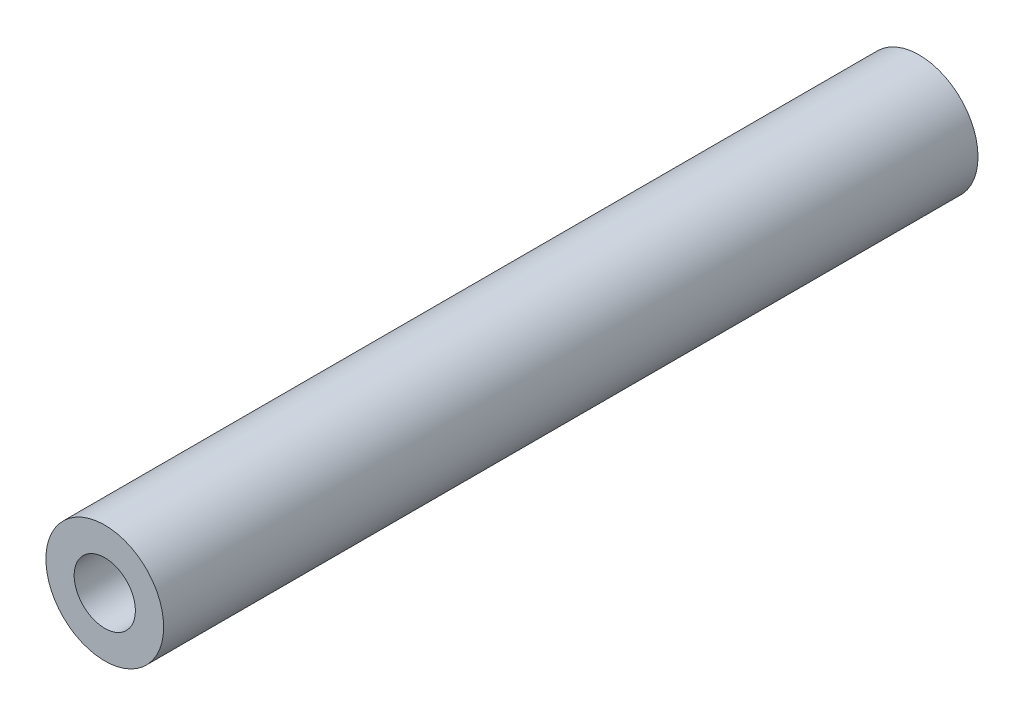
ISO-10303-21;
HEADER;
FILE_DESCRIPTION(('STEP AP214'),'2;1');
FILE_NAME('part.step','',(''),(''),'','','');
FILE_SCHEMA(('AUTOMOTIVE_DESIGN { 1 0 10303 214 1 1 1 1 }'));
ENDSEC;
DATA;
#1=APPLICATION_CONTEXT('core data for automotive mechanical design processes');
#2=APPLICATION_PROTOCOL_DEFINITION('international standard','automotive_design',2000,#1);
#3=PRODUCT_CONTEXT('',#1,'mechanical');
#4=PRODUCT('Part','Part','',(#3));
#5=PRODUCT_RELATED_PRODUCT_CATEGORY('part','',(#4));
#6=PRODUCT_DEFINITION_FORMATION('','',#4);
#7=PRODUCT_DEFINITION_CONTEXT('part definition',#1,'design');
#8=PRODUCT_DEFINITION('design','',#6,#7);
#9=PRODUCT_DEFINITION_SHAPE('','',#8);
#10=(LENGTH_UNIT() NAMED_UNIT(*) SI_UNIT(.MILLI.,.METRE.));
#11=(NAMED_UNIT(*) PLANE_ANGLE_UNIT() SI_UNIT($,.RADIAN.));
#12=(NAMED_UNIT(*) SI_UNIT($,.STERADIAN.) SOLID_ANGLE_UNIT());
#13=UNCERTAINTY_MEASURE_WITH_UNIT(LENGTH_MEASURE(1.E-05),#10,'distance_accuracy_value','');
#14=(GEOMETRIC_REPRESENTATION_CONTEXT(3) GLOBAL_UNCERTAINTY_ASSIGNED_CONTEXT((#13)) GLOBAL_UNIT_ASSIGNED_CONTEXT((#10,
#11,#12)) REPRESENTATION_CONTEXT('',''));
#15=CARTESIAN_POINT('',(0.,0.,0.));
#16=DIRECTION('',(0.,0.,1.));
#17=DIRECTION('',(1.,0.,0.));
#18=AXIS2_PLACEMENT_3D('',#15,#16,#17);
#19=CARTESIAN_POINT('',(0.,0.,21.9577));
#20=DIRECTION('',(0.,0.,1.));
#21=DIRECTION('',(1.,0.,0.));
#22=AXIS2_PLACEMENT_3D('',#19,#20,#21);
#23=PLANE('',#22);
#24=CARTESIAN_POINT('',(0.,0.,21.9577));
#25=DIRECTION('',(0.,0.,1.));
#26=DIRECTION('',(1.,0.,0.));
#27=AXIS2_PLACEMENT_3D('',#24,#25,#26);
#28=CIRCLE('',#27,1.5875);
#29=CARTESIAN_POINT('',(1.5875,0.,21.9577));
#30=VERTEX_POINT('',#29);
#31=EDGE_CURVE('E10',#30,#30,#28,.T.);
#32=ORIENTED_EDGE('',*,*,#31,.T.);
#33=EDGE_LOOP('',(#32));
#34=FACE_BOUND('',#33,.T.);
#35=CARTESIAN_POINT('',(0.,0.,21.9577));
#36=DIRECTION('',(0.,0.,1.));
#37=DIRECTION('',(1.,0.,0.));
#38=AXIS2_PLACEMENT_3D('',#35,#36,#37);
#39=CIRCLE('',#38,0.8255);
#40=CARTESIAN_POINT('',(0.8255,0.,21.9577));
#41=VERTEX_POINT('',#40);
#42=EDGE_CURVE('E43',#41,#41,#39,.T.);
#43=ORIENTED_EDGE('',*,*,#42,.F.);
#44=EDGE_LOOP('',(#43));
#45=FACE_BOUND('',#44,.T.);
#46=ADVANCED_FACE('F32',(#34,#45),#23,.T.);
#47=CARTESIAN_POINT('',(0.,0.,0.));
#48=DIRECTION('',(0.,0.,1.));
#49=DIRECTION('',(1.,0.,0.));
#50=AXIS2_PLACEMENT_3D('',#47,#48,#49);
#51=PLANE('',#50);
#52=CARTESIAN_POINT('',(0.,0.,0.));
#53=DIRECTION('',(0.,0.,1.));
#54=DIRECTION('',(1.,0.,0.));
#55=AXIS2_PLACEMENT_3D('',#52,#53,#54);
#56=CIRCLE('',#55,1.5875);
#57=CARTESIAN_POINT('',(1.5875,0.,0.));
#58=VERTEX_POINT('',#57);
#59=EDGE_CURVE('E36',#58,#58,#56,.T.);
#60=ORIENTED_EDGE('',*,*,#59,.F.);
#61=EDGE_LOOP('',(#60));
#62=FACE_BOUND('',#61,.T.);
#63=CARTESIAN_POINT('',(0.,0.,0.));
#64=DIRECTION('',(0.,0.,1.));
#65=DIRECTION('',(1.,0.,0.));
#66=AXIS2_PLACEMENT_3D('',#63,#64,#65);
#67=CIRCLE('',#66,0.8255);
#68=CARTESIAN_POINT('',(0.8255,0.,0.));
#69=VERTEX_POINT('',#68);
#70=EDGE_CURVE('E45',#69,#69,#67,.T.);
#71=ORIENTED_EDGE('',*,*,#70,.T.);
#72=EDGE_LOOP('',(#71));
#73=FACE_BOUND('',#72,.T.);
#74=ADVANCED_FACE('F55',(#62,#73),#51,.F.);
#75=CARTESIAN_POINT('',(0.,0.,21.9577));
#76=DIRECTION('',(0.,0.,-1.));
#77=DIRECTION('',(-1.,0.,0.));
#78=AXIS2_PLACEMENT_3D('',#75,#76,#77);
#79=CYLINDRICAL_SURFACE('',#78,1.5875);
#80=ORIENTED_EDGE('',*,*,#31,.F.);
#81=EDGE_LOOP('',(#80));
#82=FACE_BOUND('',#81,.T.);
#83=ORIENTED_EDGE('',*,*,#59,.T.);
#84=EDGE_LOOP('',(#83));
#85=FACE_BOUND('',#84,.T.);
#86=ADVANCED_FACE('F34',(#82,#85),#79,.T.);
#87=CARTESIAN_POINT('',(0.,0.,21.9577));
#88=DIRECTION('',(0.,0.,-1.));
#89=DIRECTION('',(-1.,0.,0.));
#90=AXIS2_PLACEMENT_3D('',#87,#88,#89);
#91=CYLINDRICAL_SURFACE('',#90,0.8255);
#92=ORIENTED_EDGE('',*,*,#42,.T.);
#93=EDGE_LOOP('',(#92));
#94=FACE_BOUND('',#93,.T.);
#95=ORIENTED_EDGE('',*,*,#70,.F.);
#96=EDGE_LOOP('',(#95));
#97=FACE_BOUND('',#96,.T.);
#98=ADVANCED_FACE('F51',(#94,#97),#91,.F.);
#99=CLOSED_SHELL('',(#46,#74,#86,#98));
#100=MANIFOLD_SOLID_BREP('B2',#99);
#101=ADVANCED_BREP_SHAPE_REPRESENTATION('',(#18,#100),#14);
#102=SHAPE_DEFINITION_REPRESENTATION(#9,#101);
ENDSEC;
END-ISO-10303-21;
